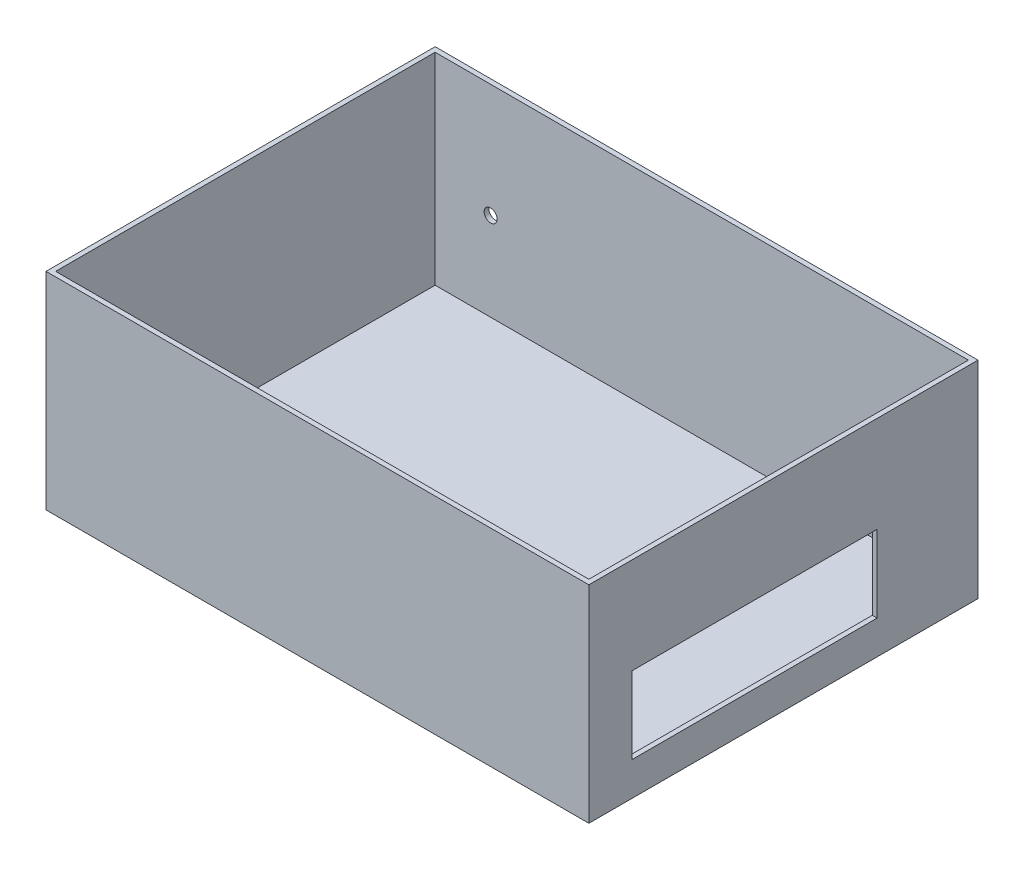
ISO-10303-21;
HEADER;
FILE_DESCRIPTION(('STEP AP214'),'2;1');
FILE_NAME('part.step','',(''),(''),'','','');
FILE_SCHEMA(('AUTOMOTIVE_DESIGN { 1 0 10303 214 1 1 1 1 }'));
ENDSEC;
DATA;
#1=APPLICATION_CONTEXT('core data for automotive mechanical design processes');
#2=APPLICATION_PROTOCOL_DEFINITION('international standard','automotive_design',2000,#1);
#3=PRODUCT_CONTEXT('',#1,'mechanical');
#4=PRODUCT('Part','Part','',(#3));
#5=PRODUCT_RELATED_PRODUCT_CATEGORY('part','',(#4));
#6=PRODUCT_DEFINITION_FORMATION('','',#4);
#7=PRODUCT_DEFINITION_CONTEXT('part definition',#1,'design');
#8=PRODUCT_DEFINITION('design','',#6,#7);
#9=PRODUCT_DEFINITION_SHAPE('','',#8);
#10=(LENGTH_UNIT() NAMED_UNIT(*) SI_UNIT(.MILLI.,.METRE.));
#11=(NAMED_UNIT(*) PLANE_ANGLE_UNIT() SI_UNIT($,.RADIAN.));
#12=(NAMED_UNIT(*) SI_UNIT($,.STERADIAN.) SOLID_ANGLE_UNIT());
#13=UNCERTAINTY_MEASURE_WITH_UNIT(LENGTH_MEASURE(1.E-05),#10,'distance_accuracy_value','');
#14=(GEOMETRIC_REPRESENTATION_CONTEXT(3) GLOBAL_UNCERTAINTY_ASSIGNED_CONTEXT((#13)) GLOBAL_UNIT_ASSIGNED_CONTEXT((#10,
#11,#12)) REPRESENTATION_CONTEXT('',''));
#15=CARTESIAN_POINT('',(0.,0.,0.));
#16=DIRECTION('',(0.,0.,1.));
#17=DIRECTION('',(1.,0.,0.));
#18=AXIS2_PLACEMENT_3D('',#15,#16,#17);
#19=CARTESIAN_POINT('',(56.5,1.,40.5));
#20=DIRECTION('',(-1.,0.,0.));
#21=DIRECTION('',(0.,0.,1.));
#22=AXIS2_PLACEMENT_3D('',#19,#20,#21);
#23=PLANE('',#22);
#24=DIRECTION('',(0.,0.,1.));
#25=VECTOR('',#24,1.);
#26=CARTESIAN_POINT('',(56.5,23.,31.5));
#27=LINE('',#26,#25);
#28=CARTESIAN_POINT('',(56.5,23.,-19.5));
#29=VERTEX_POINT('',#28);
#30=CARTESIAN_POINT('',(56.5,23.,31.5));
#31=VERTEX_POINT('',#30);
#32=EDGE_CURVE('E145',#29,#31,#27,.T.);
#33=ORIENTED_EDGE('',*,*,#32,.F.);
#34=DIRECTION('',(0.,1.,0.));
#35=VECTOR('',#34,1.);
#36=CARTESIAN_POINT('',(56.5,7.,-19.5));
#37=LINE('',#36,#35);
#38=CARTESIAN_POINT('',(56.5,7.,-19.5));
#39=VERTEX_POINT('',#38);
#40=EDGE_CURVE('E49',#39,#29,#37,.T.);
#41=ORIENTED_EDGE('',*,*,#40,.F.);
#42=DIRECTION('',(0.,0.,-1.));
#43=VECTOR('',#42,1.);
#44=CARTESIAN_POINT('',(56.5,7.,31.5));
#45=LINE('',#44,#43);
#46=CARTESIAN_POINT('',(56.5,7.,31.5));
#47=VERTEX_POINT('',#46);
#48=EDGE_CURVE('E133',#47,#39,#45,.T.);
#49=ORIENTED_EDGE('',*,*,#48,.F.);
#50=DIRECTION('',(0.,-1.,0.));
#51=VECTOR('',#50,1.);
#52=CARTESIAN_POINT('',(56.5,7.,31.5));
#53=LINE('',#52,#51);
#54=EDGE_CURVE('E141',#31,#47,#53,.T.);
#55=ORIENTED_EDGE('',*,*,#54,.F.);
#56=EDGE_LOOP('',(#33,#41,#49,#55));
#57=FACE_BOUND('',#56,.T.);
#58=DIRECTION('',(0.,0.,-1.));
#59=VECTOR('',#58,1.);
#60=CARTESIAN_POINT('',(56.5,0.,40.5));
#61=LINE('',#60,#59);
#62=CARTESIAN_POINT('',(56.5,0.,40.5));
#63=VERTEX_POINT('',#62);
#64=CARTESIAN_POINT('',(56.5,0.,-40.5));
#65=VERTEX_POINT('',#64);
#66=EDGE_CURVE('E201',#63,#65,#61,.T.);
#67=ORIENTED_EDGE('',*,*,#66,.T.);
#68=DIRECTION('',(0.,-1.,0.));
#69=VECTOR('',#68,1.);
#70=CARTESIAN_POINT('',(56.5,1.,-40.5));
#71=LINE('',#70,#69);
#72=CARTESIAN_POINT('',(56.5,43.,-40.5));
#73=VERTEX_POINT('',#72);
#74=EDGE_CURVE('E219',#73,#65,#71,.T.);
#75=ORIENTED_EDGE('',*,*,#74,.F.);
#76=DIRECTION('',(0.,0.,-1.));
#77=VECTOR('',#76,1.);
#78=CARTESIAN_POINT('',(56.5,43.,40.5));
#79=LINE('',#78,#77);
#80=CARTESIAN_POINT('',(56.5,43.,40.5));
#81=VERTEX_POINT('',#80);
#82=EDGE_CURVE('E189',#81,#73,#79,.T.);
#83=ORIENTED_EDGE('',*,*,#82,.F.);
#84=DIRECTION('',(0.,-1.,0.));
#85=VECTOR('',#84,1.);
#86=CARTESIAN_POINT('',(56.5,1.,40.5));
#87=LINE('',#86,#85);
#88=EDGE_CURVE('E210',#81,#63,#87,.T.);
#89=ORIENTED_EDGE('',*,*,#88,.T.);
#90=EDGE_LOOP('',(#67,#75,#83,#89));
#91=FACE_BOUND('',#90,.T.);
#92=ADVANCED_FACE('F35',(#57,#91),#23,.F.);
#93=CARTESIAN_POINT('',(-56.5,1.,-40.5));
#94=DIRECTION('',(0.,0.,1.));
#95=DIRECTION('',(1.,0.,0.));
#96=AXIS2_PLACEMENT_3D('',#93,#94,#95);
#97=PLANE('',#96);
#98=CARTESIAN_POINT('',(46.35,24.55,-40.5));
#99=DIRECTION('',(0.,0.,-1.));
#100=DIRECTION('',(-1.,0.,0.));
#101=AXIS2_PLACEMENT_3D('',#98,#99,#100);
#102=CIRCLE('',#101,1.35);
#103=CARTESIAN_POINT('',(45.,24.55,-40.5));
#104=VERTEX_POINT('',#103);
#105=EDGE_CURVE('E312',#104,#104,#102,.T.);
#106=ORIENTED_EDGE('',*,*,#105,.F.);
#107=EDGE_LOOP('',(#106));
#108=FACE_BOUND('',#107,.T.);
#109=CARTESIAN_POINT('',(-43.95,19.35,-40.5));
#110=DIRECTION('',(0.,0.,-1.));
#111=DIRECTION('',(-1.,0.,0.));
#112=AXIS2_PLACEMENT_3D('',#109,#110,#111);
#113=CIRCLE('',#112,1.35);
#114=CARTESIAN_POINT('',(-45.3,19.35,-40.5));
#115=VERTEX_POINT('',#114);
#116=EDGE_CURVE('E315',#115,#115,#113,.T.);
#117=ORIENTED_EDGE('',*,*,#116,.F.);
#118=EDGE_LOOP('',(#117));
#119=FACE_BOUND('',#118,.T.);
#120=DIRECTION('',(-1.,0.,0.));
#121=VECTOR('',#120,1.);
#122=CARTESIAN_POINT('',(-56.5,0.,-40.5));
#123=LINE('',#122,#121);
#124=CARTESIAN_POINT('',(-56.5,0.,-40.5));
#125=VERTEX_POINT('',#124);
#126=EDGE_CURVE('E204',#65,#125,#123,.T.);
#127=ORIENTED_EDGE('',*,*,#126,.T.);
#128=DIRECTION('',(0.,-1.,0.));
#129=VECTOR('',#128,1.);
#130=CARTESIAN_POINT('',(-56.5,1.,-40.5));
#131=LINE('',#130,#129);
#132=CARTESIAN_POINT('',(-56.5,43.,-40.5));
#133=VERTEX_POINT('',#132);
#134=EDGE_CURVE('E216',#133,#125,#131,.T.);
#135=ORIENTED_EDGE('',*,*,#134,.F.);
#136=DIRECTION('',(-1.,0.,0.));
#137=VECTOR('',#136,1.);
#138=CARTESIAN_POINT('',(-56.5,43.,-40.5));
#139=LINE('',#138,#137);
#140=EDGE_CURVE('E192',#73,#133,#139,.T.);
#141=ORIENTED_EDGE('',*,*,#140,.F.);
#142=ORIENTED_EDGE('',*,*,#74,.T.);
#143=EDGE_LOOP('',(#127,#135,#141,#142));
#144=FACE_BOUND('',#143,.T.);
#145=ADVANCED_FACE('F263',(#108,#119,#144),#97,.F.);
#146=CARTESIAN_POINT('',(-56.5,1.,40.5));
#147=DIRECTION('',(1.,0.,0.));
#148=DIRECTION('',(0.,0.,-1.));
#149=AXIS2_PLACEMENT_3D('',#146,#147,#148);
#150=PLANE('',#149);
#151=DIRECTION('',(0.,0.,1.));
#152=VECTOR('',#151,1.);
#153=CARTESIAN_POINT('',(-56.5,0.,40.5));
#154=LINE('',#153,#152);
#155=CARTESIAN_POINT('',(-56.5,0.,40.5));
#156=VERTEX_POINT('',#155);
#157=EDGE_CURVE('E206',#125,#156,#154,.T.);
#158=ORIENTED_EDGE('',*,*,#157,.T.);
#159=DIRECTION('',(0.,-1.,0.));
#160=VECTOR('',#159,1.);
#161=CARTESIAN_POINT('',(-56.5,1.,40.5));
#162=LINE('',#161,#160);
#163=CARTESIAN_POINT('',(-56.5,43.,40.5));
#164=VERTEX_POINT('',#163);
#165=EDGE_CURVE('E213',#164,#156,#162,.T.);
#166=ORIENTED_EDGE('',*,*,#165,.F.);
#167=DIRECTION('',(0.,0.,1.));
#168=VECTOR('',#167,1.);
#169=CARTESIAN_POINT('',(-56.5,43.,40.5));
#170=LINE('',#169,#168);
#171=EDGE_CURVE('E195',#133,#164,#170,.T.);
#172=ORIENTED_EDGE('',*,*,#171,.F.);
#173=ORIENTED_EDGE('',*,*,#134,.T.);
#174=EDGE_LOOP('',(#158,#166,#172,#173));
#175=FACE_BOUND('',#174,.T.);
#176=ADVANCED_FACE('F267',(#175),#150,.F.);
#177=CARTESIAN_POINT('',(-56.5,1.,40.5));
#178=DIRECTION('',(0.,0.,-1.));
#179=DIRECTION('',(-1.,0.,0.));
#180=AXIS2_PLACEMENT_3D('',#177,#178,#179);
#181=PLANE('',#180);
#182=DIRECTION('',(1.,0.,0.));
#183=VECTOR('',#182,1.);
#184=CARTESIAN_POINT('',(-56.5,0.,40.5));
#185=LINE('',#184,#183);
#186=EDGE_CURVE('E208',#156,#63,#185,.T.);
#187=ORIENTED_EDGE('',*,*,#186,.T.);
#188=ORIENTED_EDGE('',*,*,#88,.F.);
#189=DIRECTION('',(1.,0.,0.));
#190=VECTOR('',#189,1.);
#191=CARTESIAN_POINT('',(-56.5,43.,40.5));
#192=LINE('',#191,#190);
#193=EDGE_CURVE('E198',#164,#81,#192,.T.);
#194=ORIENTED_EDGE('',*,*,#193,.F.);
#195=ORIENTED_EDGE('',*,*,#165,.T.);
#196=EDGE_LOOP('',(#187,#188,#194,#195));
#197=FACE_BOUND('',#196,.T.);
#198=ADVANCED_FACE('F272',(#197),#181,.F.);
#199=CARTESIAN_POINT('',(0.,0.,0.));
#200=DIRECTION('',(0.,-1.,0.));
#201=DIRECTION('',(0.,0.,-1.));
#202=AXIS2_PLACEMENT_3D('',#199,#200,#201);
#203=PLANE('',#202);
#204=ORIENTED_EDGE('',*,*,#66,.F.);
#205=ORIENTED_EDGE('',*,*,#186,.F.);
#206=ORIENTED_EDGE('',*,*,#157,.F.);
#207=ORIENTED_EDGE('',*,*,#126,.F.);
#208=EDGE_LOOP('',(#204,#205,#206,#207));
#209=FACE_BOUND('',#208,.T.);
#210=ADVANCED_FACE('F280',(#209),#203,.T.);
#211=CARTESIAN_POINT('',(0.,43.,0.));
#212=DIRECTION('',(0.,-1.,0.));
#213=DIRECTION('',(0.,0.,-1.));
#214=AXIS2_PLACEMENT_3D('',#211,#212,#213);
#215=PLANE('',#214);
#216=ORIENTED_EDGE('',*,*,#82,.T.);
#217=ORIENTED_EDGE('',*,*,#140,.T.);
#218=ORIENTED_EDGE('',*,*,#171,.T.);
#219=ORIENTED_EDGE('',*,*,#193,.T.);
#220=EDGE_LOOP('',(#216,#217,#218,#219));
#221=FACE_BOUND('',#220,.T.);
#222=DIRECTION('',(0.,0.,-1.));
#223=VECTOR('',#222,1.);
#224=CARTESIAN_POINT('',(55.5,43.,39.5));
#225=LINE('',#224,#223);
#226=CARTESIAN_POINT('',(55.5,43.,39.5));
#227=VERTEX_POINT('',#226);
#228=CARTESIAN_POINT('',(55.5,43.,-39.5));
#229=VERTEX_POINT('',#228);
#230=EDGE_CURVE('E160',#227,#229,#225,.T.);
#231=ORIENTED_EDGE('',*,*,#230,.F.);
#232=DIRECTION('',(1.,0.,0.));
#233=VECTOR('',#232,1.);
#234=CARTESIAN_POINT('',(-55.5,43.,39.5));
#235=LINE('',#234,#233);
#236=CARTESIAN_POINT('',(-55.5,43.,39.5));
#237=VERTEX_POINT('',#236);
#238=EDGE_CURVE('E168',#237,#227,#235,.T.);
#239=ORIENTED_EDGE('',*,*,#238,.F.);
#240=DIRECTION('',(0.,0.,1.));
#241=VECTOR('',#240,1.);
#242=CARTESIAN_POINT('',(-55.5,43.,39.5));
#243=LINE('',#242,#241);
#244=CARTESIAN_POINT('',(-55.5,43.,-39.5));
#245=VERTEX_POINT('',#244);
#246=EDGE_CURVE('E165',#245,#237,#243,.T.);
#247=ORIENTED_EDGE('',*,*,#246,.F.);
#248=DIRECTION('',(-1.,0.,0.));
#249=VECTOR('',#248,1.);
#250=CARTESIAN_POINT('',(-55.5,43.,-39.5));
#251=LINE('',#250,#249);
#252=EDGE_CURVE('E162',#229,#245,#251,.T.);
#253=ORIENTED_EDGE('',*,*,#252,.F.);
#254=EDGE_LOOP('',(#231,#239,#247,#253));
#255=FACE_BOUND('',#254,.T.);
#256=ADVANCED_FACE('F250',(#221,#255),#215,.F.);
#257=CARTESIAN_POINT('',(55.5,43.,39.5));
#258=DIRECTION('',(-1.,0.,0.));
#259=DIRECTION('',(0.,0.,1.));
#260=AXIS2_PLACEMENT_3D('',#257,#258,#259);
#261=PLANE('',#260);
#262=DIRECTION('',(0.,1.,0.));
#263=VECTOR('',#262,1.);
#264=CARTESIAN_POINT('',(55.5,7.,-19.5));
#265=LINE('',#264,#263);
#266=CARTESIAN_POINT('',(55.5,7.,-19.5));
#267=VERTEX_POINT('',#266);
#268=CARTESIAN_POINT('',(55.5,23.,-19.5));
#269=VERTEX_POINT('',#268);
#270=EDGE_CURVE('E126',#267,#269,#265,.T.);
#271=ORIENTED_EDGE('',*,*,#270,.T.);
#272=DIRECTION('',(0.,0.,1.));
#273=VECTOR('',#272,1.);
#274=CARTESIAN_POINT('',(55.5,23.,31.5));
#275=LINE('',#274,#273);
#276=CARTESIAN_POINT('',(55.5,23.,31.5));
#277=VERTEX_POINT('',#276);
#278=EDGE_CURVE('E148',#269,#277,#275,.T.);
#279=ORIENTED_EDGE('',*,*,#278,.T.);
#280=DIRECTION('',(0.,-1.,0.));
#281=VECTOR('',#280,1.);
#282=CARTESIAN_POINT('',(55.5,7.,31.5));
#283=LINE('',#282,#281);
#284=CARTESIAN_POINT('',(55.5,7.,31.5));
#285=VERTEX_POINT('',#284);
#286=EDGE_CURVE('E129',#277,#285,#283,.T.);
#287=ORIENTED_EDGE('',*,*,#286,.T.);
#288=DIRECTION('',(0.,0.,-1.));
#289=VECTOR('',#288,1.);
#290=CARTESIAN_POINT('',(55.5,7.,31.5));
#291=LINE('',#290,#289);
#292=EDGE_CURVE('E130',#285,#267,#291,.T.);
#293=ORIENTED_EDGE('',*,*,#292,.T.);
#294=EDGE_LOOP('',(#271,#279,#287,#293));
#295=FACE_BOUND('',#294,.T.);
#296=DIRECTION('',(0.,0.,-1.));
#297=VECTOR('',#296,1.);
#298=CARTESIAN_POINT('',(55.5,1.,39.5));
#299=LINE('',#298,#297);
#300=CARTESIAN_POINT('',(55.5,1.,39.5));
#301=VERTEX_POINT('',#300);
#302=CARTESIAN_POINT('',(55.5,1.,-39.5));
#303=VERTEX_POINT('',#302);
#304=EDGE_CURVE('E140',#301,#303,#299,.T.);
#305=ORIENTED_EDGE('',*,*,#304,.F.);
#306=DIRECTION('',(0.,-1.,0.));
#307=VECTOR('',#306,1.);
#308=CARTESIAN_POINT('',(55.5,43.,39.5));
#309=LINE('',#308,#307);
#310=EDGE_CURVE('E170',#227,#301,#309,.T.);
#311=ORIENTED_EDGE('',*,*,#310,.F.);
#312=ORIENTED_EDGE('',*,*,#230,.T.);
#313=DIRECTION('',(0.,-1.,0.));
#314=VECTOR('',#313,1.);
#315=CARTESIAN_POINT('',(55.5,43.,-39.5));
#316=LINE('',#315,#314);
#317=EDGE_CURVE('E186',#229,#303,#316,.T.);
#318=ORIENTED_EDGE('',*,*,#317,.T.);
#319=EDGE_LOOP('',(#305,#311,#312,#318));
#320=FACE_BOUND('',#319,.T.);
#321=ADVANCED_FACE('F242',(#295,#320),#261,.T.);
#322=CARTESIAN_POINT('',(-55.5,43.,-39.5));
#323=DIRECTION('',(0.,0.,1.));
#324=DIRECTION('',(1.,0.,0.));
#325=AXIS2_PLACEMENT_3D('',#322,#323,#324);
#326=PLANE('',#325);
#327=CARTESIAN_POINT('',(46.35,24.55,-39.5));
#328=DIRECTION('',(0.,0.,1.));
#329=DIRECTION('',(1.,0.,0.));
#330=AXIS2_PLACEMENT_3D('',#327,#328,#329);
#331=CIRCLE('',#330,1.35);
#332=CARTESIAN_POINT('',(47.7,24.55,-39.5));
#333=VERTEX_POINT('',#332);
#334=EDGE_CURVE('E318',#333,#333,#331,.F.);
#335=ORIENTED_EDGE('',*,*,#334,.T.);
#336=EDGE_LOOP('',(#335));
#337=FACE_BOUND('',#336,.T.);
#338=CARTESIAN_POINT('',(-43.95,19.35,-39.5));
#339=DIRECTION('',(0.,0.,1.));
#340=DIRECTION('',(1.,0.,0.));
#341=AXIS2_PLACEMENT_3D('',#338,#339,#340);
#342=CIRCLE('',#341,1.35);
#343=CARTESIAN_POINT('',(-42.6,19.35,-39.5));
#344=VERTEX_POINT('',#343);
#345=EDGE_CURVE('E319',#344,#344,#342,.F.);
#346=ORIENTED_EDGE('',*,*,#345,.T.);
#347=EDGE_LOOP('',(#346));
#348=FACE_BOUND('',#347,.T.);
#349=DIRECTION('',(-1.,0.,0.));
#350=VECTOR('',#349,1.);
#351=CARTESIAN_POINT('',(-55.5,1.,-39.5));
#352=LINE('',#351,#350);
#353=CARTESIAN_POINT('',(-55.5,1.,-39.5));
#354=VERTEX_POINT('',#353);
#355=EDGE_CURVE('E173',#303,#354,#352,.T.);
#356=ORIENTED_EDGE('',*,*,#355,.F.);
#357=ORIENTED_EDGE('',*,*,#317,.F.);
#358=ORIENTED_EDGE('',*,*,#252,.T.);
#359=DIRECTION('',(0.,-1.,0.));
#360=VECTOR('',#359,1.);
#361=CARTESIAN_POINT('',(-55.5,43.,-39.5));
#362=LINE('',#361,#360);
#363=EDGE_CURVE('E184',#245,#354,#362,.T.);
#364=ORIENTED_EDGE('',*,*,#363,.T.);
#365=EDGE_LOOP('',(#356,#357,#358,#364));
#366=FACE_BOUND('',#365,.T.);
#367=ADVANCED_FACE('F246',(#337,#348,#366),#326,.T.);
#368=CARTESIAN_POINT('',(-55.5,43.,39.5));
#369=DIRECTION('',(1.,0.,0.));
#370=DIRECTION('',(0.,0.,-1.));
#371=AXIS2_PLACEMENT_3D('',#368,#369,#370);
#372=PLANE('',#371);
#373=DIRECTION('',(0.,0.,1.));
#374=VECTOR('',#373,1.);
#375=CARTESIAN_POINT('',(-55.5,1.,39.5));
#376=LINE('',#375,#374);
#377=CARTESIAN_POINT('',(-55.5,1.,39.5));
#378=VERTEX_POINT('',#377);
#379=EDGE_CURVE('E176',#354,#378,#376,.T.);
#380=ORIENTED_EDGE('',*,*,#379,.F.);
#381=ORIENTED_EDGE('',*,*,#363,.F.);
#382=ORIENTED_EDGE('',*,*,#246,.T.);
#383=DIRECTION('',(0.,-1.,0.));
#384=VECTOR('',#383,1.);
#385=CARTESIAN_POINT('',(-55.5,43.,39.5));
#386=LINE('',#385,#384);
#387=EDGE_CURVE('E182',#237,#378,#386,.T.);
#388=ORIENTED_EDGE('',*,*,#387,.T.);
#389=EDGE_LOOP('',(#380,#381,#382,#388));
#390=FACE_BOUND('',#389,.T.);
#391=ADVANCED_FACE('F252',(#390),#372,.T.);
#392=CARTESIAN_POINT('',(-55.5,43.,39.5));
#393=DIRECTION('',(0.,0.,-1.));
#394=DIRECTION('',(-1.,0.,0.));
#395=AXIS2_PLACEMENT_3D('',#392,#393,#394);
#396=PLANE('',#395);
#397=DIRECTION('',(1.,0.,0.));
#398=VECTOR('',#397,1.);
#399=CARTESIAN_POINT('',(-55.5,1.,39.5));
#400=LINE('',#399,#398);
#401=EDGE_CURVE('E163',#378,#301,#400,.T.);
#402=ORIENTED_EDGE('',*,*,#401,.F.);
#403=ORIENTED_EDGE('',*,*,#387,.F.);
#404=ORIENTED_EDGE('',*,*,#238,.T.);
#405=ORIENTED_EDGE('',*,*,#310,.T.);
#406=EDGE_LOOP('',(#402,#403,#404,#405));
#407=FACE_BOUND('',#406,.T.);
#408=ADVANCED_FACE('F229',(#407),#396,.T.);
#409=CARTESIAN_POINT('',(0.,1.,0.));
#410=DIRECTION('',(0.,-1.,0.));
#411=DIRECTION('',(0.,0.,-1.));
#412=AXIS2_PLACEMENT_3D('',#409,#410,#411);
#413=PLANE('',#412);
#414=CARTESIAN_POINT('',(-52.05,1.,35.5));
#415=DIRECTION('',(0.,-1.,0.));
#416=DIRECTION('',(0.,0.,-1.));
#417=AXIS2_PLACEMENT_3D('',#414,#415,#416);
#418=CIRCLE('',#417,1.55);
#419=CARTESIAN_POINT('',(-52.05,1.,33.95));
#420=VERTEX_POINT('',#419);
#421=EDGE_CURVE('E11',#420,#420,#418,.F.);
#422=ORIENTED_EDGE('',*,*,#421,.F.);
#423=EDGE_LOOP('',(#422));
#424=FACE_BOUND('',#423,.T.);
#425=CARTESIAN_POINT('',(52.05,1.,-34.25));
#426=DIRECTION('',(0.,-1.,0.));
#427=DIRECTION('',(0.,0.,-1.));
#428=AXIS2_PLACEMENT_3D('',#425,#426,#427);
#429=CIRCLE('',#428,1.55);
#430=CARTESIAN_POINT('',(52.05,1.,-35.8));
#431=VERTEX_POINT('',#430);
#432=EDGE_CURVE('E42',#431,#431,#429,.F.);
#433=ORIENTED_EDGE('',*,*,#432,.F.);
#434=EDGE_LOOP('',(#433));
#435=FACE_BOUND('',#434,.T.);
#436=ORIENTED_EDGE('',*,*,#401,.T.);
#437=ORIENTED_EDGE('',*,*,#304,.T.);
#438=ORIENTED_EDGE('',*,*,#355,.T.);
#439=ORIENTED_EDGE('',*,*,#379,.T.);
#440=EDGE_LOOP('',(#436,#437,#438,#439));
#441=FACE_BOUND('',#440,.T.);
#442=ADVANCED_FACE('F226',(#424,#435,#441),#413,.F.);
#443=CARTESIAN_POINT('',(-56.501,7.,-19.5));
#444=DIRECTION('',(0.,0.,-1.));
#445=DIRECTION('',(-1.,0.,0.));
#446=AXIS2_PLACEMENT_3D('',#443,#444,#445);
#447=PLANE('',#446);
#448=DIRECTION('',(1.,0.,0.));
#449=VECTOR('',#448,1.);
#450=CARTESIAN_POINT('',(-56.501,7.,-19.5));
#451=LINE('',#450,#449);
#452=EDGE_CURVE('E122',#267,#39,#451,.T.);
#453=ORIENTED_EDGE('',*,*,#452,.T.);
#454=ORIENTED_EDGE('',*,*,#40,.T.);
#455=DIRECTION('',(1.,0.,0.));
#456=VECTOR('',#455,1.);
#457=CARTESIAN_POINT('',(-56.501,23.,-19.5));
#458=LINE('',#457,#456);
#459=EDGE_CURVE('E153',#269,#29,#458,.T.);
#460=ORIENTED_EDGE('',*,*,#459,.F.);
#461=ORIENTED_EDGE('',*,*,#270,.F.);
#462=EDGE_LOOP('',(#453,#454,#460,#461));
#463=FACE_BOUND('',#462,.T.);
#464=ADVANCED_FACE('F124',(#463),#447,.F.);
#465=CARTESIAN_POINT('',(-56.501,7.,31.5));
#466=DIRECTION('',(0.,-1.,0.));
#467=DIRECTION('',(0.,0.,-1.));
#468=AXIS2_PLACEMENT_3D('',#465,#466,#467);
#469=PLANE('',#468);
#470=DIRECTION('',(1.,0.,0.));
#471=VECTOR('',#470,1.);
#472=CARTESIAN_POINT('',(-56.501,7.,31.5));
#473=LINE('',#472,#471);
#474=EDGE_CURVE('E136',#285,#47,#473,.T.);
#475=ORIENTED_EDGE('',*,*,#474,.T.);
#476=ORIENTED_EDGE('',*,*,#48,.T.);
#477=ORIENTED_EDGE('',*,*,#452,.F.);
#478=ORIENTED_EDGE('',*,*,#292,.F.);
#479=EDGE_LOOP('',(#475,#476,#477,#478));
#480=FACE_BOUND('',#479,.T.);
#481=ADVANCED_FACE('F134',(#480),#469,.F.);
#482=CARTESIAN_POINT('',(-56.501,7.,31.5));
#483=DIRECTION('',(0.,0.,1.));
#484=DIRECTION('',(1.,0.,0.));
#485=AXIS2_PLACEMENT_3D('',#482,#483,#484);
#486=PLANE('',#485);
#487=DIRECTION('',(1.,0.,0.));
#488=VECTOR('',#487,1.);
#489=CARTESIAN_POINT('',(-56.501,23.,31.5));
#490=LINE('',#489,#488);
#491=EDGE_CURVE('E57',#277,#31,#490,.T.);
#492=ORIENTED_EDGE('',*,*,#491,.T.);
#493=ORIENTED_EDGE('',*,*,#54,.T.);
#494=ORIENTED_EDGE('',*,*,#474,.F.);
#495=ORIENTED_EDGE('',*,*,#286,.F.);
#496=EDGE_LOOP('',(#492,#493,#494,#495));
#497=FACE_BOUND('',#496,.T.);
#498=ADVANCED_FACE('F294',(#497),#486,.F.);
#499=CARTESIAN_POINT('',(-56.501,23.,31.5));
#500=DIRECTION('',(0.,1.,0.));
#501=DIRECTION('',(0.,0.,1.));
#502=AXIS2_PLACEMENT_3D('',#499,#500,#501);
#503=PLANE('',#502);
#504=ORIENTED_EDGE('',*,*,#459,.T.);
#505=ORIENTED_EDGE('',*,*,#32,.T.);
#506=ORIENTED_EDGE('',*,*,#491,.F.);
#507=ORIENTED_EDGE('',*,*,#278,.F.);
#508=EDGE_LOOP('',(#504,#505,#506,#507));
#509=FACE_BOUND('',#508,.T.);
#510=ADVANCED_FACE('F358',(#509),#503,.F.);
#511=CARTESIAN_POINT('',(52.05,2.1,-34.25));
#512=DIRECTION('',(0.,1.,0.));
#513=DIRECTION('',(0.,0.,1.));
#514=AXIS2_PLACEMENT_3D('',#511,#512,#513);
#515=PLANE('',#514);
#516=CARTESIAN_POINT('',(52.05,2.1,-34.25));
#517=DIRECTION('',(0.,1.,0.));
#518=DIRECTION('',(0.,0.,1.));
#519=AXIS2_PLACEMENT_3D('',#516,#517,#518);
#520=CIRCLE('',#519,1.55);
#521=CARTESIAN_POINT('',(52.05,2.1,-32.7));
#522=VERTEX_POINT('',#521);
#523=EDGE_CURVE('E154',#522,#522,#520,.T.);
#524=ORIENTED_EDGE('',*,*,#523,.T.);
#525=EDGE_LOOP('',(#524));
#526=FACE_BOUND('',#525,.T.);
#527=CARTESIAN_POINT('',(52.05,2.1,-34.25));
#528=DIRECTION('',(0.,1.,0.));
#529=DIRECTION('',(0.,0.,1.));
#530=AXIS2_PLACEMENT_3D('',#527,#528,#529);
#531=CIRCLE('',#530,0.550000000000003);
#532=CARTESIAN_POINT('',(52.05,2.1,-33.7));
#533=VERTEX_POINT('',#532);
#534=EDGE_CURVE('E299',#533,#533,#531,.T.);
#535=ORIENTED_EDGE('',*,*,#534,.F.);
#536=EDGE_LOOP('',(#535));
#537=FACE_BOUND('',#536,.T.);
#538=ADVANCED_FACE('F355',(#526,#537),#515,.T.);
#539=CARTESIAN_POINT('',(52.05,2.1,-34.25));
#540=DIRECTION('',(0.,-1.,0.));
#541=DIRECTION('',(0.,0.,-1.));
#542=AXIS2_PLACEMENT_3D('',#539,#540,#541);
#543=CYLINDRICAL_SURFACE('',#542,1.55);
#544=ORIENTED_EDGE('',*,*,#523,.F.);
#545=EDGE_LOOP('',(#544));
#546=FACE_BOUND('',#545,.T.);
#547=ORIENTED_EDGE('',*,*,#432,.T.);
#548=EDGE_LOOP('',(#547));
#549=FACE_BOUND('',#548,.T.);
#550=ADVANCED_FACE('F224',(#546,#549),#543,.T.);
#551=CARTESIAN_POINT('',(52.05,2.1,-34.25));
#552=DIRECTION('',(0.,-1.,0.));
#553=DIRECTION('',(0.,0.,-1.));
#554=AXIS2_PLACEMENT_3D('',#551,#552,#553);
#555=CYLINDRICAL_SURFACE('',#554,0.550000000000003);
#556=ORIENTED_EDGE('',*,*,#534,.T.);
#557=EDGE_LOOP('',(#556));
#558=FACE_BOUND('',#557,.T.);
#559=CARTESIAN_POINT('',(52.05,1.,-34.25));
#560=DIRECTION('',(0.,1.,0.));
#561=DIRECTION('',(0.,0.,1.));
#562=AXIS2_PLACEMENT_3D('',#559,#560,#561);
#563=CIRCLE('',#562,0.550000000000003);
#564=CARTESIAN_POINT('',(52.05,1.,-33.7));
#565=VERTEX_POINT('',#564);
#566=EDGE_CURVE('E300',#565,#565,#563,.T.);
#567=ORIENTED_EDGE('',*,*,#566,.F.);
#568=EDGE_LOOP('',(#567));
#569=FACE_BOUND('',#568,.T.);
#570=ADVANCED_FACE('F351',(#558,#569),#555,.F.);
#571=ORIENTED_EDGE('',*,*,#566,.T.);
#572=EDGE_LOOP('',(#571));
#573=FACE_BOUND('',#572,.T.);
#574=ADVANCED_FACE('F233',(#573),#413,.F.);
#575=CARTESIAN_POINT('',(-52.05,2.1,35.5));
#576=DIRECTION('',(0.,1.,0.));
#577=DIRECTION('',(0.,0.,1.));
#578=AXIS2_PLACEMENT_3D('',#575,#576,#577);
#579=PLANE('',#578);
#580=CARTESIAN_POINT('',(-52.05,2.1,35.5));
#581=DIRECTION('',(0.,1.,0.));
#582=DIRECTION('',(0.,0.,1.));
#583=AXIS2_PLACEMENT_3D('',#580,#581,#582);
#584=CIRCLE('',#583,1.55);
#585=CARTESIAN_POINT('',(-52.05,2.1,37.05));
#586=VERTEX_POINT('',#585);
#587=EDGE_CURVE('E303',#586,#586,#584,.T.);
#588=ORIENTED_EDGE('',*,*,#587,.T.);
#589=EDGE_LOOP('',(#588));
#590=FACE_BOUND('',#589,.T.);
#591=CARTESIAN_POINT('',(-52.05,2.1,35.5));
#592=DIRECTION('',(0.,1.,0.));
#593=DIRECTION('',(0.,0.,1.));
#594=AXIS2_PLACEMENT_3D('',#591,#592,#593);
#595=CIRCLE('',#594,0.550000000000003);
#596=CARTESIAN_POINT('',(-52.05,2.1,36.05));
#597=VERTEX_POINT('',#596);
#598=EDGE_CURVE('E308',#597,#597,#595,.T.);
#599=ORIENTED_EDGE('',*,*,#598,.F.);
#600=EDGE_LOOP('',(#599));
#601=FACE_BOUND('',#600,.T.);
#602=ADVANCED_FACE('F344',(#590,#601),#579,.T.);
#603=CARTESIAN_POINT('',(-52.05,2.1,35.5));
#604=DIRECTION('',(0.,-1.,0.));
#605=DIRECTION('',(0.,0.,-1.));
#606=AXIS2_PLACEMENT_3D('',#603,#604,#605);
#607=CYLINDRICAL_SURFACE('',#606,1.55);
#608=ORIENTED_EDGE('',*,*,#587,.F.);
#609=EDGE_LOOP('',(#608));
#610=FACE_BOUND('',#609,.T.);
#611=ORIENTED_EDGE('',*,*,#421,.T.);
#612=EDGE_LOOP('',(#611));
#613=FACE_BOUND('',#612,.T.);
#614=ADVANCED_FACE('F342',(#610,#613),#607,.T.);
#615=CARTESIAN_POINT('',(-52.05,2.1,35.5));
#616=DIRECTION('',(0.,-1.,0.));
#617=DIRECTION('',(0.,0.,-1.));
#618=AXIS2_PLACEMENT_3D('',#615,#616,#617);
#619=CYLINDRICAL_SURFACE('',#618,0.550000000000003);
#620=ORIENTED_EDGE('',*,*,#598,.T.);
#621=EDGE_LOOP('',(#620));
#622=FACE_BOUND('',#621,.T.);
#623=CARTESIAN_POINT('',(-52.05,1.,35.5));
#624=DIRECTION('',(0.,1.,0.));
#625=DIRECTION('',(0.,0.,1.));
#626=AXIS2_PLACEMENT_3D('',#623,#624,#625);
#627=CIRCLE('',#626,0.550000000000003);
#628=CARTESIAN_POINT('',(-52.05,1.,36.05));
#629=VERTEX_POINT('',#628);
#630=EDGE_CURVE('E309',#629,#629,#627,.T.);
#631=ORIENTED_EDGE('',*,*,#630,.F.);
#632=EDGE_LOOP('',(#631));
#633=FACE_BOUND('',#632,.T.);
#634=ADVANCED_FACE('F339',(#622,#633),#619,.F.);
#635=ORIENTED_EDGE('',*,*,#630,.T.);
#636=EDGE_LOOP('',(#635));
#637=FACE_BOUND('',#636,.T.);
#638=ADVANCED_FACE('F232',(#637),#413,.F.);
#639=CARTESIAN_POINT('',(-43.95,19.35,40.501));
#640=DIRECTION('',(0.,0.,-1.));
#641=DIRECTION('',(-1.,0.,0.));
#642=AXIS2_PLACEMENT_3D('',#639,#640,#641);
#643=CYLINDRICAL_SURFACE('',#642,1.35);
#644=ORIENTED_EDGE('',*,*,#345,.F.);
#645=EDGE_LOOP('',(#644));
#646=FACE_BOUND('',#645,.T.);
#647=ORIENTED_EDGE('',*,*,#116,.T.);
#648=EDGE_LOOP('',(#647));
#649=FACE_BOUND('',#648,.T.);
#650=ADVANCED_FACE('F331',(#646,#649),#643,.F.);
#651=CARTESIAN_POINT('',(46.35,24.55,40.501));
#652=DIRECTION('',(0.,0.,-1.));
#653=DIRECTION('',(-1.,0.,0.));
#654=AXIS2_PLACEMENT_3D('',#651,#652,#653);
#655=CYLINDRICAL_SURFACE('',#654,1.35);
#656=ORIENTED_EDGE('',*,*,#334,.F.);
#657=EDGE_LOOP('',(#656));
#658=FACE_BOUND('',#657,.T.);
#659=ORIENTED_EDGE('',*,*,#105,.T.);
#660=EDGE_LOOP('',(#659));
#661=FACE_BOUND('',#660,.T.);
#662=ADVANCED_FACE('F328',(#658,#661),#655,.F.);
#663=CLOSED_SHELL('',(#92,#145,#176,#198,#210,#256,#321,#367,#391,#408,#442,#464,#481,#498,#510,
#538,#550,#570,#574,#602,#614,#634,#638,#650,#662));
#664=MANIFOLD_SOLID_BREP('B2',#663);
#665=ADVANCED_BREP_SHAPE_REPRESENTATION('',(#18,#664),#14);
#666=SHAPE_DEFINITION_REPRESENTATION(#9,#665);
ENDSEC;
END-ISO-10303-21;
